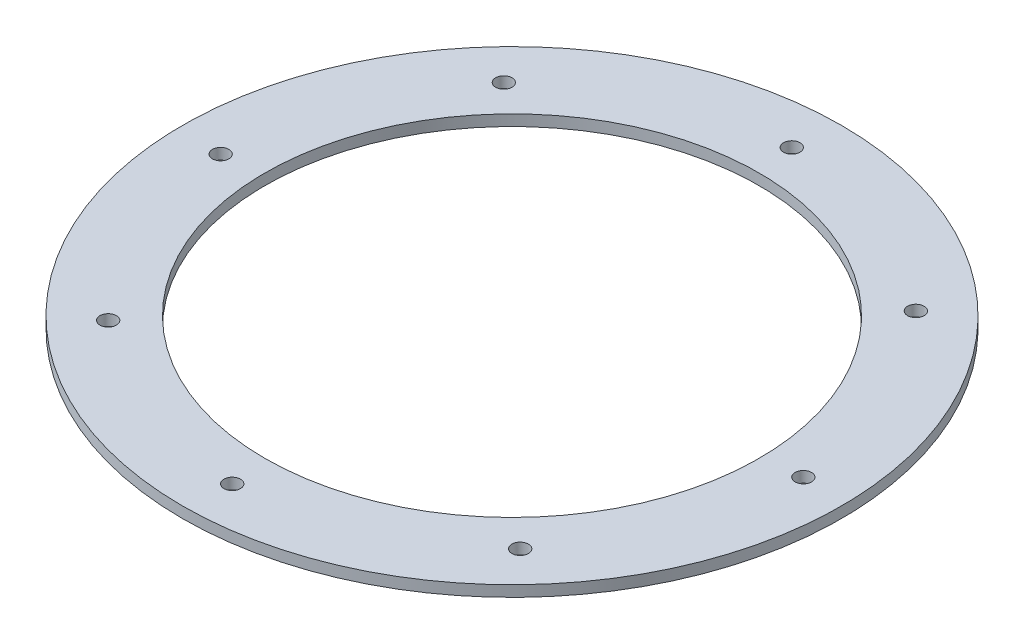
ISO-10303-21;
HEADER;
FILE_DESCRIPTION(('STEP AP214'),'2;1');
FILE_NAME('part.step','',(''),(''),'','','');
FILE_SCHEMA(('AUTOMOTIVE_DESIGN { 1 0 10303 214 1 1 1 1 }'));
ENDSEC;
DATA;
#1=APPLICATION_CONTEXT('core data for automotive mechanical design processes');
#2=APPLICATION_PROTOCOL_DEFINITION('international standard','automotive_design',2000,#1);
#3=PRODUCT_CONTEXT('',#1,'mechanical');
#4=PRODUCT('Part','Part','',(#3));
#5=PRODUCT_RELATED_PRODUCT_CATEGORY('part','',(#4));
#6=PRODUCT_DEFINITION_FORMATION('','',#4);
#7=PRODUCT_DEFINITION_CONTEXT('part definition',#1,'design');
#8=PRODUCT_DEFINITION('design','',#6,#7);
#9=PRODUCT_DEFINITION_SHAPE('','',#8);
#10=(LENGTH_UNIT() NAMED_UNIT(*) SI_UNIT(.MILLI.,.METRE.));
#11=(NAMED_UNIT(*) PLANE_ANGLE_UNIT() SI_UNIT($,.RADIAN.));
#12=(NAMED_UNIT(*) SI_UNIT($,.STERADIAN.) SOLID_ANGLE_UNIT());
#13=UNCERTAINTY_MEASURE_WITH_UNIT(LENGTH_MEASURE(1.E-05),#10,'distance_accuracy_value','');
#14=(GEOMETRIC_REPRESENTATION_CONTEXT(3) GLOBAL_UNCERTAINTY_ASSIGNED_CONTEXT((#13)) GLOBAL_UNIT_ASSIGNED_CONTEXT((#10,
#11,#12)) REPRESENTATION_CONTEXT('',''));
#15=CARTESIAN_POINT('',(0.,0.,0.));
#16=DIRECTION('',(0.,0.,1.));
#17=DIRECTION('',(1.,0.,0.));
#18=AXIS2_PLACEMENT_3D('',#15,#16,#17);
#19=CARTESIAN_POINT('',(0.,2.,0.));
#20=DIRECTION('',(0.,1.,0.));
#21=DIRECTION('',(0.,0.,1.));
#22=AXIS2_PLACEMENT_3D('',#19,#20,#21);
#23=PLANE('',#22);
#24=CARTESIAN_POINT('',(-1.05382224829115,2.,-51.989320621345));
#25=DIRECTION('',(0.,1.,0.));
#26=DIRECTION('',(0.,0.,1.));
#27=AXIS2_PLACEMENT_3D('',#24,#25,#26);
#28=CIRCLE('',#27,1.5);
#29=CARTESIAN_POINT('',(-1.05382224829115,2.,-50.489320621345));
#30=VERTEX_POINT('',#29);
#31=EDGE_CURVE('E59',#30,#30,#28,.T.);
#32=ORIENTED_EDGE('',*,*,#31,.F.);
#33=EDGE_LOOP('',(#32));
#34=FACE_BOUND('',#33,.T.);
#35=CARTESIAN_POINT('',(36.0168363027028,2.,-37.5071660185665));
#36=DIRECTION('',(0.,1.,0.));
#37=DIRECTION('',(0.,0.,1.));
#38=AXIS2_PLACEMENT_3D('',#35,#36,#37);
#39=CIRCLE('',#38,1.5);
#40=CARTESIAN_POINT('',(36.0168363027028,2.,-36.0071660185665));
#41=VERTEX_POINT('',#40);
#42=EDGE_CURVE('E62',#41,#41,#39,.T.);
#43=ORIENTED_EDGE('',*,*,#42,.F.);
#44=EDGE_LOOP('',(#43));
#45=FACE_BOUND('',#44,.T.);
#46=CARTESIAN_POINT('',(51.989320621345,2.,-1.05382224829133));
#47=DIRECTION('',(0.,1.,0.));
#48=DIRECTION('',(0.,0.,1.));
#49=AXIS2_PLACEMENT_3D('',#46,#47,#48);
#50=CIRCLE('',#49,1.5);
#51=CARTESIAN_POINT('',(51.989320621345,2.,0.446177751708673));
#52=VERTEX_POINT('',#51);
#53=EDGE_CURVE('E65',#52,#52,#50,.T.);
#54=ORIENTED_EDGE('',*,*,#53,.F.);
#55=EDGE_LOOP('',(#54));
#56=FACE_BOUND('',#55,.T.);
#57=CARTESIAN_POINT('',(37.5071660185664,2.,36.0168363027029));
#58=DIRECTION('',(0.,1.,0.));
#59=DIRECTION('',(0.,0.,1.));
#60=AXIS2_PLACEMENT_3D('',#57,#58,#59);
#61=CIRCLE('',#60,1.5);
#62=CARTESIAN_POINT('',(37.5071660185664,2.,37.5168363027029));
#63=VERTEX_POINT('',#62);
#64=EDGE_CURVE('E68',#63,#63,#61,.T.);
#65=ORIENTED_EDGE('',*,*,#64,.F.);
#66=EDGE_LOOP('',(#65));
#67=FACE_BOUND('',#66,.T.);
#68=CARTESIAN_POINT('',(1.05382224829079,2.,51.989320621345));
#69=DIRECTION('',(0.,1.,0.));
#70=DIRECTION('',(0.,0.,1.));
#71=AXIS2_PLACEMENT_3D('',#68,#69,#70);
#72=CIRCLE('',#71,1.5);
#73=CARTESIAN_POINT('',(1.05382224829079,2.,53.489320621345));
#74=VERTEX_POINT('',#73);
#75=EDGE_CURVE('E71',#74,#74,#72,.T.);
#76=ORIENTED_EDGE('',*,*,#75,.F.);
#77=EDGE_LOOP('',(#76));
#78=FACE_BOUND('',#77,.T.);
#79=CARTESIAN_POINT('',(-36.016836302703,2.,37.5071660185662));
#80=DIRECTION('',(0.,1.,0.));
#81=DIRECTION('',(0.,0.,1.));
#82=AXIS2_PLACEMENT_3D('',#79,#80,#81);
#83=CIRCLE('',#82,1.5);
#84=CARTESIAN_POINT('',(-36.016836302703,2.,39.0071660185662));
#85=VERTEX_POINT('',#84);
#86=EDGE_CURVE('E74',#85,#85,#83,.T.);
#87=ORIENTED_EDGE('',*,*,#86,.F.);
#88=EDGE_LOOP('',(#87));
#89=FACE_BOUND('',#88,.T.);
#90=CARTESIAN_POINT('',(-37.5071660185666,2.,-36.0168363027026));
#91=DIRECTION('',(0.,1.,0.));
#92=DIRECTION('',(0.,0.,1.));
#93=AXIS2_PLACEMENT_3D('',#90,#91,#92);
#94=CIRCLE('',#93,1.5);
#95=CARTESIAN_POINT('',(-37.5071660185666,2.,-34.5168363027026));
#96=VERTEX_POINT('',#95);
#97=EDGE_CURVE('E77',#96,#96,#94,.T.);
#98=ORIENTED_EDGE('',*,*,#97,.F.);
#99=EDGE_LOOP('',(#98));
#100=FACE_BOUND('',#99,.T.);
#101=CARTESIAN_POINT('',(-51.989320621345,2.,1.05382224829133));
#102=DIRECTION('',(0.,1.,0.));
#103=DIRECTION('',(0.,0.,1.));
#104=AXIS2_PLACEMENT_3D('',#101,#102,#103);
#105=CIRCLE('',#104,1.5);
#106=CARTESIAN_POINT('',(-51.989320621345,2.,2.55382224829134));
#107=VERTEX_POINT('',#106);
#108=EDGE_CURVE('E51',#107,#107,#105,.T.);
#109=ORIENTED_EDGE('',*,*,#108,.F.);
#110=EDGE_LOOP('',(#109));
#111=FACE_BOUND('',#110,.T.);
#112=CARTESIAN_POINT('',(0.,2.,0.));
#113=DIRECTION('',(0.,1.,0.));
#114=DIRECTION('',(0.,0.,1.));
#115=AXIS2_PLACEMENT_3D('',#112,#113,#114);
#116=CIRCLE('',#115,60.);
#117=CARTESIAN_POINT('',(0.,2.,60.));
#118=VERTEX_POINT('',#117);
#119=EDGE_CURVE('E10',#118,#118,#116,.T.);
#120=ORIENTED_EDGE('',*,*,#119,.T.);
#121=EDGE_LOOP('',(#120));
#122=FACE_BOUND('',#121,.T.);
#123=CARTESIAN_POINT('',(0.,2.,0.));
#124=DIRECTION('',(0.,1.,0.));
#125=DIRECTION('',(0.,0.,1.));
#126=AXIS2_PLACEMENT_3D('',#123,#124,#125);
#127=CIRCLE('',#126,45.);
#128=CARTESIAN_POINT('',(0.,2.,45.));
#129=VERTEX_POINT('',#128);
#130=EDGE_CURVE('E46',#129,#129,#127,.T.);
#131=ORIENTED_EDGE('',*,*,#130,.F.);
#132=EDGE_LOOP('',(#131));
#133=FACE_BOUND('',#132,.T.);
#134=ADVANCED_FACE('F35',(#34,#45,#56,#67,#78,#89,#100,#111,#122,#133),#23,.T.);
#135=CARTESIAN_POINT('',(0.,0.,0.));
#136=DIRECTION('',(0.,1.,0.));
#137=DIRECTION('',(0.,0.,1.));
#138=AXIS2_PLACEMENT_3D('',#135,#136,#137);
#139=PLANE('',#138);
#140=CARTESIAN_POINT('',(-1.05382224829115,0.,-51.989320621345));
#141=DIRECTION('',(0.,-1.,0.));
#142=DIRECTION('',(1.,0.,0.));
#143=AXIS2_PLACEMENT_3D('',#140,#141,#142);
#144=CIRCLE('',#143,1.5);
#145=CARTESIAN_POINT('',(0.446177751708855,0.,-51.989320621345));
#146=VERTEX_POINT('',#145);
#147=EDGE_CURVE('E83',#146,#146,#144,.T.);
#148=ORIENTED_EDGE('',*,*,#147,.F.);
#149=EDGE_LOOP('',(#148));
#150=FACE_BOUND('',#149,.T.);
#151=CARTESIAN_POINT('',(36.0168363027028,0.,-37.5071660185665));
#152=DIRECTION('',(0.,-1.,0.));
#153=DIRECTION('',(0.707106781186544,0.,0.707106781186551));
#154=AXIS2_PLACEMENT_3D('',#151,#152,#153);
#155=CIRCLE('',#154,1.5);
#156=CARTESIAN_POINT('',(37.0774964744826,0.,-36.4465058467867));
#157=VERTEX_POINT('',#156);
#158=EDGE_CURVE('E91',#157,#157,#155,.T.);
#159=ORIENTED_EDGE('',*,*,#158,.F.);
#160=EDGE_LOOP('',(#159));
#161=FACE_BOUND('',#160,.T.);
#162=CARTESIAN_POINT('',(51.989320621345,0.,-1.05382224829133));
#163=DIRECTION('',(0.,-1.,0.));
#164=DIRECTION('',(0.,0.,1.));
#165=AXIS2_PLACEMENT_3D('',#162,#163,#164);
#166=CIRCLE('',#165,1.5);
#167=CARTESIAN_POINT('',(51.989320621345,0.,0.446177751708673));
#168=VERTEX_POINT('',#167);
#169=EDGE_CURVE('E87',#168,#168,#166,.T.);
#170=ORIENTED_EDGE('',*,*,#169,.F.);
#171=EDGE_LOOP('',(#170));
#172=FACE_BOUND('',#171,.T.);
#173=CARTESIAN_POINT('',(37.5071660185664,0.,36.0168363027029));
#174=DIRECTION('',(0.,-1.,0.));
#175=DIRECTION('',(-0.707106781186554,0.,0.707106781186541));
#176=AXIS2_PLACEMENT_3D('',#173,#174,#175);
#177=CIRCLE('',#176,1.5);
#178=CARTESIAN_POINT('',(36.4465058467865,0.,37.0774964744827));
#179=VERTEX_POINT('',#178);
#180=EDGE_CURVE('E84',#179,#179,#177,.T.);
#181=ORIENTED_EDGE('',*,*,#180,.F.);
#182=EDGE_LOOP('',(#181));
#183=FACE_BOUND('',#182,.T.);
#184=CARTESIAN_POINT('',(1.05382224829079,0.,51.989320621345));
#185=DIRECTION('',(0.,-1.,0.));
#186=DIRECTION('',(-1.,0.,0.));
#187=AXIS2_PLACEMENT_3D('',#184,#185,#186);
#188=CIRCLE('',#187,1.5);
#189=CARTESIAN_POINT('',(-0.446177751709218,0.,51.989320621345));
#190=VERTEX_POINT('',#189);
#191=EDGE_CURVE('E88',#190,#190,#188,.T.);
#192=ORIENTED_EDGE('',*,*,#191,.F.);
#193=EDGE_LOOP('',(#192));
#194=FACE_BOUND('',#193,.T.);
#195=CARTESIAN_POINT('',(-36.016836302703,0.,37.5071660185662));
#196=DIRECTION('',(0.,-1.,0.));
#197=DIRECTION('',(-0.707106781186539,0.,-0.707106781186556));
#198=AXIS2_PLACEMENT_3D('',#195,#196,#197);
#199=CIRCLE('',#198,1.5);
#200=CARTESIAN_POINT('',(-37.0774964744828,0.,36.4465058467864));
#201=VERTEX_POINT('',#200);
#202=EDGE_CURVE('E96',#201,#201,#199,.T.);
#203=ORIENTED_EDGE('',*,*,#202,.F.);
#204=EDGE_LOOP('',(#203));
#205=FACE_BOUND('',#204,.T.);
#206=CARTESIAN_POINT('',(-37.5071660185666,0.,-36.0168363027026));
#207=DIRECTION('',(0.,-1.,0.));
#208=DIRECTION('',(0.707106781186549,0.,-0.707106781186546));
#209=AXIS2_PLACEMENT_3D('',#206,#207,#208);
#210=CIRCLE('',#209,1.5);
#211=CARTESIAN_POINT('',(-36.4465058467868,0.,-37.0774964744825));
#212=VERTEX_POINT('',#211);
#213=EDGE_CURVE('E80',#212,#212,#210,.T.);
#214=ORIENTED_EDGE('',*,*,#213,.F.);
#215=EDGE_LOOP('',(#214));
#216=FACE_BOUND('',#215,.T.);
#217=CARTESIAN_POINT('',(-51.989320621345,0.,1.05382224829133));
#218=DIRECTION('',(0.,-1.,0.));
#219=DIRECTION('',(0.,0.,-1.));
#220=AXIS2_PLACEMENT_3D('',#217,#218,#219);
#221=CIRCLE('',#220,1.5);
#222=CARTESIAN_POINT('',(-51.989320621345,0.,-0.446177751708673));
#223=VERTEX_POINT('',#222);
#224=EDGE_CURVE('E56',#223,#223,#221,.T.);
#225=ORIENTED_EDGE('',*,*,#224,.F.);
#226=EDGE_LOOP('',(#225));
#227=FACE_BOUND('',#226,.T.);
#228=CARTESIAN_POINT('',(0.,0.,0.));
#229=DIRECTION('',(0.,1.,0.));
#230=DIRECTION('',(0.,0.,1.));
#231=AXIS2_PLACEMENT_3D('',#228,#229,#230);
#232=CIRCLE('',#231,60.);
#233=CARTESIAN_POINT('',(0.,0.,60.));
#234=VERTEX_POINT('',#233);
#235=EDGE_CURVE('E39',#234,#234,#232,.T.);
#236=ORIENTED_EDGE('',*,*,#235,.F.);
#237=EDGE_LOOP('',(#236));
#238=FACE_BOUND('',#237,.T.);
#239=CARTESIAN_POINT('',(0.,0.,0.));
#240=DIRECTION('',(0.,1.,0.));
#241=DIRECTION('',(0.,0.,1.));
#242=AXIS2_PLACEMENT_3D('',#239,#240,#241);
#243=CIRCLE('',#242,45.);
#244=CARTESIAN_POINT('',(0.,0.,45.));
#245=VERTEX_POINT('',#244);
#246=EDGE_CURVE('E48',#245,#245,#243,.T.);
#247=ORIENTED_EDGE('',*,*,#246,.T.);
#248=EDGE_LOOP('',(#247));
#249=FACE_BOUND('',#248,.T.);
#250=ADVANCED_FACE('F104',(#150,#161,#172,#183,#194,#205,#216,#227,#238,#249),#139,.F.);
#251=CARTESIAN_POINT('',(0.,2.,0.));
#252=DIRECTION('',(0.,-1.,0.));
#253=DIRECTION('',(0.,0.,-1.));
#254=AXIS2_PLACEMENT_3D('',#251,#252,#253);
#255=CYLINDRICAL_SURFACE('',#254,60.);
#256=ORIENTED_EDGE('',*,*,#119,.F.);
#257=EDGE_LOOP('',(#256));
#258=FACE_BOUND('',#257,.T.);
#259=ORIENTED_EDGE('',*,*,#235,.T.);
#260=EDGE_LOOP('',(#259));
#261=FACE_BOUND('',#260,.T.);
#262=ADVANCED_FACE('F37',(#258,#261),#255,.T.);
#263=CARTESIAN_POINT('',(0.,2.,0.));
#264=DIRECTION('',(0.,-1.,0.));
#265=DIRECTION('',(0.,0.,-1.));
#266=AXIS2_PLACEMENT_3D('',#263,#264,#265);
#267=CYLINDRICAL_SURFACE('',#266,45.);
#268=ORIENTED_EDGE('',*,*,#130,.T.);
#269=EDGE_LOOP('',(#268));
#270=FACE_BOUND('',#269,.T.);
#271=ORIENTED_EDGE('',*,*,#246,.F.);
#272=EDGE_LOOP('',(#271));
#273=FACE_BOUND('',#272,.T.);
#274=ADVANCED_FACE('F118',(#270,#273),#267,.F.);
#275=CARTESIAN_POINT('',(-51.989320621345,50.,1.05382224829133));
#276=DIRECTION('',(0.,-1.,0.));
#277=DIRECTION('',(0.,0.,-1.));
#278=AXIS2_PLACEMENT_3D('',#275,#276,#277);
#279=CYLINDRICAL_SURFACE('',#278,1.5);
#280=ORIENTED_EDGE('',*,*,#108,.T.);
#281=EDGE_LOOP('',(#280));
#282=FACE_BOUND('',#281,.T.);
#283=ORIENTED_EDGE('',*,*,#224,.T.);
#284=EDGE_LOOP('',(#283));
#285=FACE_BOUND('',#284,.T.);
#286=ADVANCED_FACE('F120',(#282,#285),#279,.F.);
#287=CARTESIAN_POINT('',(-37.5071660185666,50.,-36.0168363027026));
#288=DIRECTION('',(0.,-1.,0.));
#289=DIRECTION('',(0.,0.,-1.));
#290=AXIS2_PLACEMENT_3D('',#287,#288,#289);
#291=CYLINDRICAL_SURFACE('',#290,1.5);
#292=ORIENTED_EDGE('',*,*,#97,.T.);
#293=EDGE_LOOP('',(#292));
#294=FACE_BOUND('',#293,.T.);
#295=ORIENTED_EDGE('',*,*,#213,.T.);
#296=EDGE_LOOP('',(#295));
#297=FACE_BOUND('',#296,.T.);
#298=ADVANCED_FACE('F127',(#294,#297),#291,.F.);
#299=CARTESIAN_POINT('',(-36.016836302703,50.,37.5071660185662));
#300=DIRECTION('',(0.,-1.,0.));
#301=DIRECTION('',(0.,0.,-1.));
#302=AXIS2_PLACEMENT_3D('',#299,#300,#301);
#303=CYLINDRICAL_SURFACE('',#302,1.5);
#304=ORIENTED_EDGE('',*,*,#86,.T.);
#305=EDGE_LOOP('',(#304));
#306=FACE_BOUND('',#305,.T.);
#307=ORIENTED_EDGE('',*,*,#202,.T.);
#308=EDGE_LOOP('',(#307));
#309=FACE_BOUND('',#308,.T.);
#310=ADVANCED_FACE('F158',(#306,#309),#303,.F.);
#311=CARTESIAN_POINT('',(1.05382224829079,50.,51.989320621345));
#312=DIRECTION('',(0.,-1.,0.));
#313=DIRECTION('',(0.,0.,-1.));
#314=AXIS2_PLACEMENT_3D('',#311,#312,#313);
#315=CYLINDRICAL_SURFACE('',#314,1.5);
#316=ORIENTED_EDGE('',*,*,#75,.T.);
#317=EDGE_LOOP('',(#316));
#318=FACE_BOUND('',#317,.T.);
#319=ORIENTED_EDGE('',*,*,#191,.T.);
#320=EDGE_LOOP('',(#319));
#321=FACE_BOUND('',#320,.T.);
#322=ADVANCED_FACE('F102',(#318,#321),#315,.F.);
#323=CARTESIAN_POINT('',(37.5071660185664,50.,36.0168363027029));
#324=DIRECTION('',(0.,-1.,0.));
#325=DIRECTION('',(0.,0.,-1.));
#326=AXIS2_PLACEMENT_3D('',#323,#324,#325);
#327=CYLINDRICAL_SURFACE('',#326,1.5);
#328=ORIENTED_EDGE('',*,*,#64,.T.);
#329=EDGE_LOOP('',(#328));
#330=FACE_BOUND('',#329,.T.);
#331=ORIENTED_EDGE('',*,*,#180,.T.);
#332=EDGE_LOOP('',(#331));
#333=FACE_BOUND('',#332,.T.);
#334=ADVANCED_FACE('F166',(#330,#333),#327,.F.);
#335=CARTESIAN_POINT('',(51.989320621345,50.,-1.05382224829133));
#336=DIRECTION('',(0.,-1.,0.));
#337=DIRECTION('',(0.,0.,-1.));
#338=AXIS2_PLACEMENT_3D('',#335,#336,#337);
#339=CYLINDRICAL_SURFACE('',#338,1.5);
#340=ORIENTED_EDGE('',*,*,#53,.T.);
#341=EDGE_LOOP('',(#340));
#342=FACE_BOUND('',#341,.T.);
#343=ORIENTED_EDGE('',*,*,#169,.T.);
#344=EDGE_LOOP('',(#343));
#345=FACE_BOUND('',#344,.T.);
#346=ADVANCED_FACE('F169',(#342,#345),#339,.F.);
#347=CARTESIAN_POINT('',(36.0168363027028,50.,-37.5071660185665));
#348=DIRECTION('',(0.,-1.,0.));
#349=DIRECTION('',(0.,0.,-1.));
#350=AXIS2_PLACEMENT_3D('',#347,#348,#349);
#351=CYLINDRICAL_SURFACE('',#350,1.5);
#352=ORIENTED_EDGE('',*,*,#42,.T.);
#353=EDGE_LOOP('',(#352));
#354=FACE_BOUND('',#353,.T.);
#355=ORIENTED_EDGE('',*,*,#158,.T.);
#356=EDGE_LOOP('',(#355));
#357=FACE_BOUND('',#356,.T.);
#358=ADVANCED_FACE('F173',(#354,#357),#351,.F.);
#359=CARTESIAN_POINT('',(-1.05382224829115,50.,-51.989320621345));
#360=DIRECTION('',(0.,-1.,0.));
#361=DIRECTION('',(0.,0.,-1.));
#362=AXIS2_PLACEMENT_3D('',#359,#360,#361);
#363=CYLINDRICAL_SURFACE('',#362,1.5);
#364=ORIENTED_EDGE('',*,*,#31,.T.);
#365=EDGE_LOOP('',(#364));
#366=FACE_BOUND('',#365,.T.);
#367=ORIENTED_EDGE('',*,*,#147,.T.);
#368=EDGE_LOOP('',(#367));
#369=FACE_BOUND('',#368,.T.);
#370=ADVANCED_FACE('F177',(#366,#369),#363,.F.);
#371=CLOSED_SHELL('',(#134,#250,#262,#274,#286,#298,#310,#322,#334,#346,#358,#370));
#372=MANIFOLD_SOLID_BREP('B2',#371);
#373=ADVANCED_BREP_SHAPE_REPRESENTATION('',(#18,#372),#14);
#374=SHAPE_DEFINITION_REPRESENTATION(#9,#373);
ENDSEC;
END-ISO-10303-21;
